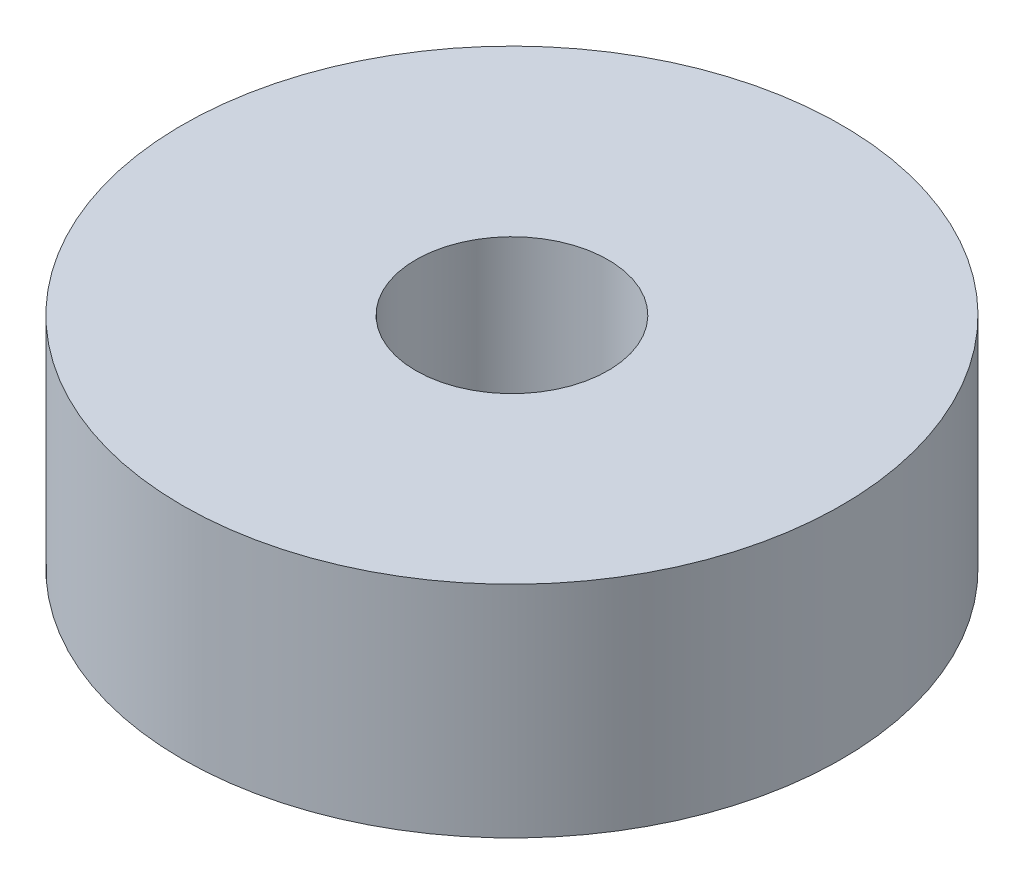
ISO-10303-21;
HEADER;
FILE_DESCRIPTION(('STEP AP214'),'2;1');
FILE_NAME('part.step','',(''),(''),'','','');
FILE_SCHEMA(('AUTOMOTIVE_DESIGN { 1 0 10303 214 1 1 1 1 }'));
ENDSEC;
DATA;
#1=APPLICATION_CONTEXT('core data for automotive mechanical design processes');
#2=APPLICATION_PROTOCOL_DEFINITION('international standard','automotive_design',2000,#1);
#3=PRODUCT_CONTEXT('',#1,'mechanical');
#4=PRODUCT('Part','Part','',(#3));
#5=PRODUCT_RELATED_PRODUCT_CATEGORY('part','',(#4));
#6=PRODUCT_DEFINITION_FORMATION('','',#4);
#7=PRODUCT_DEFINITION_CONTEXT('part definition',#1,'design');
#8=PRODUCT_DEFINITION('design','',#6,#7);
#9=PRODUCT_DEFINITION_SHAPE('','',#8);
#10=(LENGTH_UNIT() NAMED_UNIT(*) SI_UNIT(.MILLI.,.METRE.));
#11=(NAMED_UNIT(*) PLANE_ANGLE_UNIT() SI_UNIT($,.RADIAN.));
#12=(NAMED_UNIT(*) SI_UNIT($,.STERADIAN.) SOLID_ANGLE_UNIT());
#13=UNCERTAINTY_MEASURE_WITH_UNIT(LENGTH_MEASURE(1.E-05),#10,'distance_accuracy_value','');
#14=(GEOMETRIC_REPRESENTATION_CONTEXT(3) GLOBAL_UNCERTAINTY_ASSIGNED_CONTEXT((#13)) GLOBAL_UNIT_ASSIGNED_CONTEXT((#10,
#11,#12)) REPRESENTATION_CONTEXT('',''));
#15=CARTESIAN_POINT('',(0.,0.,0.));
#16=DIRECTION('',(0.,0.,1.));
#17=DIRECTION('',(1.,0.,0.));
#18=AXIS2_PLACEMENT_3D('',#15,#16,#17);
#19=CARTESIAN_POINT('',(0.,4.,0.));
#20=DIRECTION('',(0.,1.,0.));
#21=DIRECTION('',(0.,0.,1.));
#22=AXIS2_PLACEMENT_3D('',#19,#20,#21);
#23=PLANE('',#22);
#24=CARTESIAN_POINT('',(0.,4.,0.));
#25=DIRECTION('',(0.,1.,0.));
#26=DIRECTION('',(0.,0.,1.));
#27=AXIS2_PLACEMENT_3D('',#24,#25,#26);
#28=CIRCLE('',#27,6.);
#29=CARTESIAN_POINT('',(0.,4.,6.));
#30=VERTEX_POINT('',#29);
#31=EDGE_CURVE('E10',#30,#30,#28,.T.);
#32=ORIENTED_EDGE('',*,*,#31,.T.);
#33=EDGE_LOOP('',(#32));
#34=FACE_BOUND('',#33,.T.);
#35=CARTESIAN_POINT('',(0.,4.,0.));
#36=DIRECTION('',(0.,1.,0.));
#37=DIRECTION('',(0.,0.,1.));
#38=AXIS2_PLACEMENT_3D('',#35,#36,#37);
#39=CIRCLE('',#38,1.75);
#40=CARTESIAN_POINT('',(0.,4.,1.75));
#41=VERTEX_POINT('',#40);
#42=EDGE_CURVE('E46',#41,#41,#39,.T.);
#43=ORIENTED_EDGE('',*,*,#42,.F.);
#44=EDGE_LOOP('',(#43));
#45=FACE_BOUND('',#44,.T.);
#46=ADVANCED_FACE('F35',(#34,#45),#23,.T.);
#47=CARTESIAN_POINT('',(0.,0.,0.));
#48=DIRECTION('',(0.,1.,0.));
#49=DIRECTION('',(0.,0.,1.));
#50=AXIS2_PLACEMENT_3D('',#47,#48,#49);
#51=PLANE('',#50);
#52=CARTESIAN_POINT('',(0.,0.,0.));
#53=DIRECTION('',(0.,1.,0.));
#54=DIRECTION('',(0.,0.,1.));
#55=AXIS2_PLACEMENT_3D('',#52,#53,#54);
#56=CIRCLE('',#55,6.);
#57=CARTESIAN_POINT('',(0.,0.,6.));
#58=VERTEX_POINT('',#57);
#59=EDGE_CURVE('E39',#58,#58,#56,.T.);
#60=ORIENTED_EDGE('',*,*,#59,.F.);
#61=EDGE_LOOP('',(#60));
#62=FACE_BOUND('',#61,.T.);
#63=CARTESIAN_POINT('',(0.,0.,0.));
#64=DIRECTION('',(0.,1.,0.));
#65=DIRECTION('',(0.,0.,1.));
#66=AXIS2_PLACEMENT_3D('',#63,#64,#65);
#67=CIRCLE('',#66,1.75);
#68=CARTESIAN_POINT('',(0.,0.,1.75));
#69=VERTEX_POINT('',#68);
#70=EDGE_CURVE('E48',#69,#69,#67,.T.);
#71=ORIENTED_EDGE('',*,*,#70,.T.);
#72=EDGE_LOOP('',(#71));
#73=FACE_BOUND('',#72,.T.);
#74=ADVANCED_FACE('F58',(#62,#73),#51,.F.);
#75=CARTESIAN_POINT('',(0.,4.,0.));
#76=DIRECTION('',(0.,-1.,0.));
#77=DIRECTION('',(0.,0.,-1.));
#78=AXIS2_PLACEMENT_3D('',#75,#76,#77);
#79=CYLINDRICAL_SURFACE('',#78,6.);
#80=ORIENTED_EDGE('',*,*,#31,.F.);
#81=EDGE_LOOP('',(#80));
#82=FACE_BOUND('',#81,.T.);
#83=ORIENTED_EDGE('',*,*,#59,.T.);
#84=EDGE_LOOP('',(#83));
#85=FACE_BOUND('',#84,.T.);
#86=ADVANCED_FACE('F37',(#82,#85),#79,.T.);
#87=CARTESIAN_POINT('',(0.,4.,0.));
#88=DIRECTION('',(0.,-1.,0.));
#89=DIRECTION('',(0.,0.,-1.));
#90=AXIS2_PLACEMENT_3D('',#87,#88,#89);
#91=CYLINDRICAL_SURFACE('',#90,1.75);
#92=ORIENTED_EDGE('',*,*,#42,.T.);
#93=EDGE_LOOP('',(#92));
#94=FACE_BOUND('',#93,.T.);
#95=ORIENTED_EDGE('',*,*,#70,.F.);
#96=EDGE_LOOP('',(#95));
#97=FACE_BOUND('',#96,.T.);
#98=ADVANCED_FACE('F54',(#94,#97),#91,.F.);
#99=CLOSED_SHELL('',(#46,#74,#86,#98));
#100=MANIFOLD_SOLID_BREP('B2',#99);
#101=ADVANCED_BREP_SHAPE_REPRESENTATION('',(#18,#100),#14);
#102=SHAPE_DEFINITION_REPRESENTATION(#9,#101);
ENDSEC;
END-ISO-10303-21;
